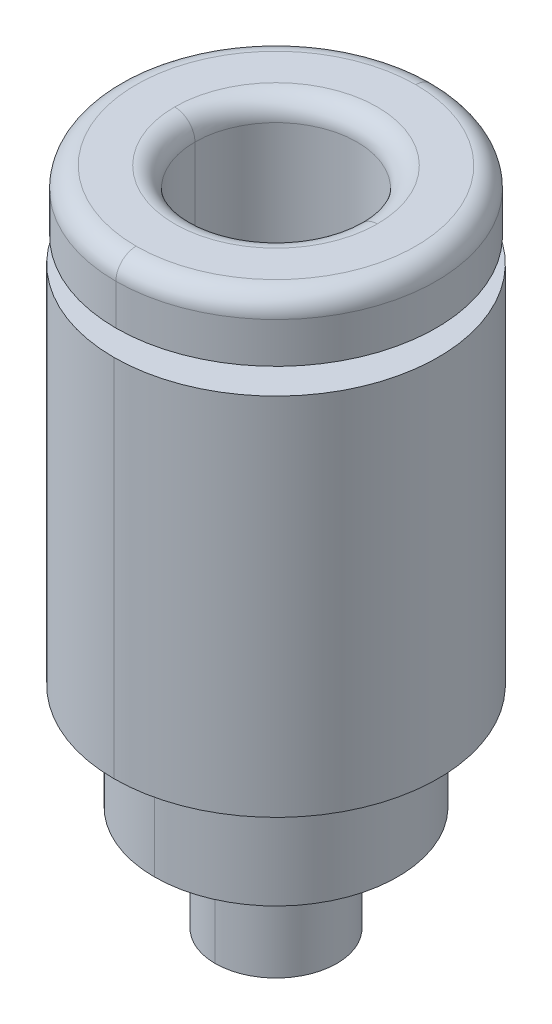
ISO-10303-21;
HEADER;
FILE_DESCRIPTION(('STEP AP214'),'2;1');
FILE_NAME('part.step','',(''),(''),'','','');
FILE_SCHEMA(('AUTOMOTIVE_DESIGN { 1 0 10303 214 1 1 1 1 }'));
ENDSEC;
DATA;
#1=APPLICATION_CONTEXT('core data for automotive mechanical design processes');
#2=APPLICATION_PROTOCOL_DEFINITION('international standard','automotive_design',2000,#1);
#3=PRODUCT_CONTEXT('',#1,'mechanical');
#4=PRODUCT('Part','Part','',(#3));
#5=PRODUCT_RELATED_PRODUCT_CATEGORY('part','',(#4));
#6=PRODUCT_DEFINITION_FORMATION('','',#4);
#7=PRODUCT_DEFINITION_CONTEXT('part definition',#1,'design');
#8=PRODUCT_DEFINITION('design','',#6,#7);
#9=PRODUCT_DEFINITION_SHAPE('','',#8);
#10=(LENGTH_UNIT() NAMED_UNIT(*) SI_UNIT(.MILLI.,.METRE.));
#11=(NAMED_UNIT(*) PLANE_ANGLE_UNIT() SI_UNIT($,.RADIAN.));
#12=(NAMED_UNIT(*) SI_UNIT($,.STERADIAN.) SOLID_ANGLE_UNIT());
#13=UNCERTAINTY_MEASURE_WITH_UNIT(LENGTH_MEASURE(1.E-05),#10,'distance_accuracy_value','');
#14=(GEOMETRIC_REPRESENTATION_CONTEXT(3) GLOBAL_UNCERTAINTY_ASSIGNED_CONTEXT((#13)) GLOBAL_UNIT_ASSIGNED_CONTEXT((#10,
#11,#12)) REPRESENTATION_CONTEXT('',''));
#15=CARTESIAN_POINT('',(0.,0.,0.));
#16=DIRECTION('',(0.,0.,1.));
#17=DIRECTION('',(1.,0.,0.));
#18=AXIS2_PLACEMENT_3D('',#15,#16,#17);
#19=CARTESIAN_POINT('',(0.,0.,0.));
#20=DIRECTION('',(0.,1.,0.));
#21=DIRECTION('',(-1.,0.,0.));
#22=AXIS2_PLACEMENT_3D('',#19,#20,#21);
#23=CYLINDRICAL_SURFACE('',#22,2.);
#24=CARTESIAN_POINT('',(0.,-12.7,0.));
#25=DIRECTION('',(0.,1.,0.));
#26=DIRECTION('',(-1.,0.,0.));
#27=AXIS2_PLACEMENT_3D('',#24,#25,#26);
#28=CIRCLE('',#27,2.);
#29=CARTESIAN_POINT('',(2.,-12.7,0.));
#30=VERTEX_POINT('',#29);
#31=CARTESIAN_POINT('',(-2.,-12.7,0.));
#32=VERTEX_POINT('',#31);
#33=EDGE_CURVE('E41',#30,#32,#28,.T.);
#34=ORIENTED_EDGE('',*,*,#33,.F.);
#35=DIRECTION('',(0.,1.,0.));
#36=VECTOR('',#35,1.);
#37=CARTESIAN_POINT('',(2.,0.,0.));
#38=LINE('',#37,#36);
#39=CARTESIAN_POINT('',(2.,-0.5,0.));
#40=VERTEX_POINT('',#39);
#41=EDGE_CURVE('E10',#30,#40,#38,.T.);
#42=ORIENTED_EDGE('',*,*,#41,.T.);
#43=CARTESIAN_POINT('',(0.,-0.5,0.));
#44=DIRECTION('',(0.,1.,0.));
#45=DIRECTION('',(-1.,0.,0.));
#46=AXIS2_PLACEMENT_3D('',#43,#44,#45);
#47=CIRCLE('',#46,2.);
#48=CARTESIAN_POINT('',(-2.,-0.5,0.));
#49=VERTEX_POINT('',#48);
#50=EDGE_CURVE('E30',#40,#49,#47,.T.);
#51=ORIENTED_EDGE('',*,*,#50,.T.);
#52=DIRECTION('',(0.,1.,0.));
#53=VECTOR('',#52,1.);
#54=CARTESIAN_POINT('',(-2.,0.,0.));
#55=LINE('',#54,#53);
#56=EDGE_CURVE('E344',#32,#49,#55,.T.);
#57=ORIENTED_EDGE('',*,*,#56,.F.);
#58=EDGE_LOOP('',(#34,#42,#51,#57));
#59=FACE_BOUND('',#58,.T.);
#60=ADVANCED_FACE('F16',(#59),#23,.F.);
#61=CARTESIAN_POINT('',(0.,-0.5,0.));
#62=DIRECTION('',(0.,1.,0.));
#63=DIRECTION('',(-1.,0.,0.));
#64=AXIS2_PLACEMENT_3D('',#61,#62,#63);
#65=TOROIDAL_SURFACE('',#64,2.5,0.5);
#66=CARTESIAN_POINT('',(0.,0.,0.));
#67=DIRECTION('',(0.,1.,0.));
#68=DIRECTION('',(-1.,0.,0.));
#69=AXIS2_PLACEMENT_3D('',#66,#67,#68);
#70=CIRCLE('',#69,2.5);
#71=CARTESIAN_POINT('',(-2.5,0.,0.));
#72=VERTEX_POINT('',#71);
#73=CARTESIAN_POINT('',(2.5,0.,0.));
#74=VERTEX_POINT('',#73);
#75=EDGE_CURVE('E295',#72,#74,#70,.T.);
#76=ORIENTED_EDGE('',*,*,#75,.T.);
#77=CARTESIAN_POINT('',(2.5,-0.5,0.));
#78=DIRECTION('',(0.,0.,1.));
#79=DIRECTION('',(1.,0.,0.));
#80=AXIS2_PLACEMENT_3D('',#77,#78,#79);
#81=CIRCLE('',#80,0.5);
#82=EDGE_CURVE('E243',#74,#40,#81,.T.);
#83=ORIENTED_EDGE('',*,*,#82,.T.);
#84=CARTESIAN_POINT('',(0.,-0.5,0.));
#85=DIRECTION('',(0.,1.,0.));
#86=DIRECTION('',(-1.,0.,0.));
#87=AXIS2_PLACEMENT_3D('',#84,#85,#86);
#88=CIRCLE('',#87,2.);
#89=EDGE_CURVE('E247',#49,#40,#88,.T.);
#90=ORIENTED_EDGE('',*,*,#89,.F.);
#91=CARTESIAN_POINT('',(-2.5,-0.5,0.));
#92=DIRECTION('',(0.,0.,-1.));
#93=DIRECTION('',(-1.,0.,0.));
#94=AXIS2_PLACEMENT_3D('',#91,#92,#93);
#95=CIRCLE('',#94,0.5);
#96=EDGE_CURVE('E341',#72,#49,#95,.T.);
#97=ORIENTED_EDGE('',*,*,#96,.F.);
#98=EDGE_LOOP('',(#76,#83,#90,#97));
#99=FACE_BOUND('',#98,.T.);
#100=ADVANCED_FACE('F441',(#99),#65,.T.);
#101=CARTESIAN_POINT('',(0.,-20.5426406871193,0.));
#102=DIRECTION('',(0.,1.,0.));
#103=DIRECTION('',(0.,0.,1.));
#104=AXIS2_PLACEMENT_3D('',#101,#102,#103);
#105=CYLINDRICAL_SURFACE('',#104,1.5);
#106=CARTESIAN_POINT('',(0.,-16.3,0.));
#107=DIRECTION('',(0.,-1.,0.));
#108=DIRECTION('',(0.,0.,1.));
#109=AXIS2_PLACEMENT_3D('',#106,#107,#108);
#110=CIRCLE('',#109,1.5);
#111=CARTESIAN_POINT('',(0.,-16.3,-1.5));
#112=VERTEX_POINT('',#111);
#113=CARTESIAN_POINT('',(0.,-16.3,1.5));
#114=VERTEX_POINT('',#113);
#115=EDGE_CURVE('E322',#112,#114,#110,.T.);
#116=ORIENTED_EDGE('',*,*,#115,.F.);
#117=DIRECTION('',(0.,1.,0.));
#118=VECTOR('',#117,1.);
#119=CARTESIAN_POINT('',(0.,-20.5426406871193,-1.5));
#120=LINE('',#119,#118);
#121=CARTESIAN_POINT('',(0.,-13.7,-1.5));
#122=VERTEX_POINT('',#121);
#123=EDGE_CURVE('E239',#112,#122,#120,.T.);
#124=ORIENTED_EDGE('',*,*,#123,.T.);
#125=CARTESIAN_POINT('',(0.,-13.7,0.));
#126=DIRECTION('',(0.,1.,0.));
#127=DIRECTION('',(0.,0.,1.));
#128=AXIS2_PLACEMENT_3D('',#125,#126,#127);
#129=CIRCLE('',#128,1.5);
#130=CARTESIAN_POINT('',(0.,-13.7,1.5));
#131=VERTEX_POINT('',#130);
#132=EDGE_CURVE('E209',#131,#122,#129,.T.);
#133=ORIENTED_EDGE('',*,*,#132,.F.);
#134=DIRECTION('',(0.,1.,0.));
#135=VECTOR('',#134,1.);
#136=CARTESIAN_POINT('',(0.,-20.5426406871193,1.5));
#137=LINE('',#136,#135);
#138=EDGE_CURVE('E323',#114,#131,#137,.T.);
#139=ORIENTED_EDGE('',*,*,#138,.F.);
#140=EDGE_LOOP('',(#116,#124,#133,#139));
#141=FACE_BOUND('',#140,.T.);
#142=ADVANCED_FACE('F448',(#141),#105,.T.);
#143=CARTESIAN_POINT('',(0.,-22.1852813742385,0.));
#144=DIRECTION('',(0.,1.,0.));
#145=DIRECTION('',(0.,0.,1.));
#146=AXIS2_PLACEMENT_3D('',#143,#144,#145);
#147=CYLINDRICAL_SURFACE('',#146,3.);
#148=CARTESIAN_POINT('',(0.,-13.7,0.));
#149=DIRECTION('',(0.,-1.,0.));
#150=DIRECTION('',(0.,0.,1.));
#151=AXIS2_PLACEMENT_3D('',#148,#149,#150);
#152=CIRCLE('',#151,3.);
#153=CARTESIAN_POINT('',(0.,-13.7,-3.));
#154=VERTEX_POINT('',#153);
#155=CARTESIAN_POINT('',(0.,-13.7,3.));
#156=VERTEX_POINT('',#155);
#157=EDGE_CURVE('E199',#154,#156,#152,.T.);
#158=ORIENTED_EDGE('',*,*,#157,.F.);
#159=DIRECTION('',(0.,1.,0.));
#160=VECTOR('',#159,1.);
#161=CARTESIAN_POINT('',(0.,-22.1852813742385,-3.));
#162=LINE('',#161,#160);
#163=CARTESIAN_POINT('',(0.,-11.1,-3.));
#164=VERTEX_POINT('',#163);
#165=EDGE_CURVE('E224',#154,#164,#162,.T.);
#166=ORIENTED_EDGE('',*,*,#165,.T.);
#167=CARTESIAN_POINT('',(0.,-11.1,0.));
#168=DIRECTION('',(0.,1.,0.));
#169=DIRECTION('',(0.,0.,1.));
#170=AXIS2_PLACEMENT_3D('',#167,#168,#169);
#171=CIRCLE('',#170,3.);
#172=CARTESIAN_POINT('',(0.,-11.1,3.));
#173=VERTEX_POINT('',#172);
#174=EDGE_CURVE('E214',#173,#164,#171,.T.);
#175=ORIENTED_EDGE('',*,*,#174,.F.);
#176=DIRECTION('',(0.,1.,0.));
#177=VECTOR('',#176,1.);
#178=CARTESIAN_POINT('',(0.,-22.1852813742385,3.));
#179=LINE('',#178,#177);
#180=EDGE_CURVE('E213',#156,#173,#179,.T.);
#181=ORIENTED_EDGE('',*,*,#180,.F.);
#182=EDGE_LOOP('',(#158,#166,#175,#181));
#183=FACE_BOUND('',#182,.T.);
#184=ADVANCED_FACE('F212',(#183),#147,.T.);
#185=CARTESIAN_POINT('',(0.,-22.4137084989848,0.));
#186=DIRECTION('',(0.,1.,0.));
#187=DIRECTION('',(0.,0.,1.));
#188=AXIS2_PLACEMENT_3D('',#185,#186,#187);
#189=CYLINDRICAL_SURFACE('',#188,4.);
#190=CARTESIAN_POINT('',(0.,-11.1,0.));
#191=DIRECTION('',(0.,-1.,0.));
#192=DIRECTION('',(0.,0.,1.));
#193=AXIS2_PLACEMENT_3D('',#190,#191,#192);
#194=CIRCLE('',#193,4.);
#195=CARTESIAN_POINT('',(0.,-11.1,-4.));
#196=VERTEX_POINT('',#195);
#197=CARTESIAN_POINT('',(0.,-11.1,4.));
#198=VERTEX_POINT('',#197);
#199=EDGE_CURVE('E151',#196,#198,#194,.T.);
#200=ORIENTED_EDGE('',*,*,#199,.F.);
#201=DIRECTION('',(0.,1.,0.));
#202=VECTOR('',#201,1.);
#203=CARTESIAN_POINT('',(0.,-22.4137084989848,-4.));
#204=LINE('',#203,#202);
#205=CARTESIAN_POINT('',(0.,-2.1,-4.));
#206=VERTEX_POINT('',#205);
#207=EDGE_CURVE('E333',#196,#206,#204,.T.);
#208=ORIENTED_EDGE('',*,*,#207,.T.);
#209=CARTESIAN_POINT('',(0.,-2.1,0.));
#210=DIRECTION('',(0.,1.,0.));
#211=DIRECTION('',(0.,0.,1.));
#212=AXIS2_PLACEMENT_3D('',#209,#210,#211);
#213=CIRCLE('',#212,4.);
#214=CARTESIAN_POINT('',(0.,-2.1,4.));
#215=VERTEX_POINT('',#214);
#216=EDGE_CURVE('E268',#215,#206,#213,.T.);
#217=ORIENTED_EDGE('',*,*,#216,.F.);
#218=DIRECTION('',(0.,1.,0.));
#219=VECTOR('',#218,1.);
#220=CARTESIAN_POINT('',(0.,-22.4137084989848,4.));
#221=LINE('',#220,#219);
#222=EDGE_CURVE('E138',#198,#215,#221,.T.);
#223=ORIENTED_EDGE('',*,*,#222,.F.);
#224=EDGE_LOOP('',(#200,#208,#217,#223));
#225=FACE_BOUND('',#224,.T.);
#226=ADVANCED_FACE('F428',(#225),#189,.T.);
#227=CARTESIAN_POINT('',(0.,-0.5,0.));
#228=DIRECTION('',(0.,1.,0.));
#229=DIRECTION('',(0.,0.,1.));
#230=AXIS2_PLACEMENT_3D('',#227,#228,#229);
#231=TOROIDAL_SURFACE('',#230,3.45,0.5);
#232=CARTESIAN_POINT('',(0.,-0.5,0.));
#233=DIRECTION('',(0.,1.,0.));
#234=DIRECTION('',(0.,0.,1.));
#235=AXIS2_PLACEMENT_3D('',#232,#233,#234);
#236=CIRCLE('',#235,3.95);
#237=CARTESIAN_POINT('',(0.,-0.5,3.95));
#238=VERTEX_POINT('',#237);
#239=CARTESIAN_POINT('',(0.,-0.5,-3.95));
#240=VERTEX_POINT('',#239);
#241=EDGE_CURVE('E332',#238,#240,#236,.T.);
#242=ORIENTED_EDGE('',*,*,#241,.T.);
#243=CARTESIAN_POINT('',(0.,-0.5,-3.45));
#244=DIRECTION('',(1.,0.,0.));
#245=DIRECTION('',(0.,0.,-1.));
#246=AXIS2_PLACEMENT_3D('',#243,#244,#245);
#247=CIRCLE('',#246,0.5);
#248=CARTESIAN_POINT('',(0.,0.,-3.45));
#249=VERTEX_POINT('',#248);
#250=EDGE_CURVE('E336',#240,#249,#247,.T.);
#251=ORIENTED_EDGE('',*,*,#250,.T.);
#252=CARTESIAN_POINT('',(0.,0.,0.));
#253=DIRECTION('',(0.,1.,0.));
#254=DIRECTION('',(0.,0.,1.));
#255=AXIS2_PLACEMENT_3D('',#252,#253,#254);
#256=CIRCLE('',#255,3.45);
#257=CARTESIAN_POINT('',(0.,0.,3.45));
#258=VERTEX_POINT('',#257);
#259=EDGE_CURVE('E277',#258,#249,#256,.T.);
#260=ORIENTED_EDGE('',*,*,#259,.F.);
#261=CARTESIAN_POINT('',(0.,-0.5,3.45));
#262=DIRECTION('',(-1.,0.,0.));
#263=DIRECTION('',(0.,0.,1.));
#264=AXIS2_PLACEMENT_3D('',#261,#262,#263);
#265=CIRCLE('',#264,0.5);
#266=EDGE_CURVE('E262',#238,#258,#265,.T.);
#267=ORIENTED_EDGE('',*,*,#266,.F.);
#268=EDGE_LOOP('',(#242,#251,#260,#267));
#269=FACE_BOUND('',#268,.T.);
#270=ADVANCED_FACE('F529',(#269),#231,.T.);
#271=CARTESIAN_POINT('',(0.,0.,0.));
#272=DIRECTION('',(0.,1.,0.));
#273=DIRECTION('',(0.,0.,1.));
#274=AXIS2_PLACEMENT_3D('',#271,#272,#273);
#275=CYLINDRICAL_SURFACE('',#274,3.95);
#276=CARTESIAN_POINT('',(0.,-1.5,0.));
#277=DIRECTION('',(0.,1.,0.));
#278=DIRECTION('',(0.,0.,1.));
#279=AXIS2_PLACEMENT_3D('',#276,#277,#278);
#280=CIRCLE('',#279,3.95);
#281=CARTESIAN_POINT('',(0.,-1.5,3.95));
#282=VERTEX_POINT('',#281);
#283=CARTESIAN_POINT('',(0.,-1.5,-3.95));
#284=VERTEX_POINT('',#283);
#285=EDGE_CURVE('E340',#282,#284,#280,.T.);
#286=ORIENTED_EDGE('',*,*,#285,.T.);
#287=DIRECTION('',(0.,1.,0.));
#288=VECTOR('',#287,1.);
#289=CARTESIAN_POINT('',(0.,0.,-3.95));
#290=LINE('',#289,#288);
#291=EDGE_CURVE('E337',#284,#240,#290,.T.);
#292=ORIENTED_EDGE('',*,*,#291,.T.);
#293=ORIENTED_EDGE('',*,*,#241,.F.);
#294=DIRECTION('',(0.,1.,0.));
#295=VECTOR('',#294,1.);
#296=CARTESIAN_POINT('',(0.,0.,3.95));
#297=LINE('',#296,#295);
#298=EDGE_CURVE('E296',#282,#238,#297,.T.);
#299=ORIENTED_EDGE('',*,*,#298,.F.);
#300=EDGE_LOOP('',(#286,#292,#293,#299));
#301=FACE_BOUND('',#300,.T.);
#302=ADVANCED_FACE('F457',(#301),#275,.T.);
#303=CARTESIAN_POINT('',(0.,0.,0.));
#304=DIRECTION('',(0.,1.,0.));
#305=DIRECTION('',(0.,0.,1.));
#306=AXIS2_PLACEMENT_3D('',#303,#304,#305);
#307=CYLINDRICAL_SURFACE('',#306,2.195);
#308=CARTESIAN_POINT('',(0.,-2.1,0.));
#309=DIRECTION('',(0.,1.,0.));
#310=DIRECTION('',(0.,0.,1.));
#311=AXIS2_PLACEMENT_3D('',#308,#309,#310);
#312=CIRCLE('',#311,2.195);
#313=CARTESIAN_POINT('',(0.,-2.1,2.195));
#314=VERTEX_POINT('',#313);
#315=CARTESIAN_POINT('',(0.,-2.1,-2.195));
#316=VERTEX_POINT('',#315);
#317=EDGE_CURVE('E274',#314,#316,#312,.T.);
#318=ORIENTED_EDGE('',*,*,#317,.T.);
#319=DIRECTION('',(0.,1.,0.));
#320=VECTOR('',#319,1.);
#321=CARTESIAN_POINT('',(0.,0.,-2.195));
#322=LINE('',#321,#320);
#323=CARTESIAN_POINT('',(0.,-1.5,-2.195));
#324=VERTEX_POINT('',#323);
#325=EDGE_CURVE('E271',#316,#324,#322,.T.);
#326=ORIENTED_EDGE('',*,*,#325,.T.);
#327=CARTESIAN_POINT('',(0.,-1.5,0.));
#328=DIRECTION('',(0.,1.,0.));
#329=DIRECTION('',(0.,0.,1.));
#330=AXIS2_PLACEMENT_3D('',#327,#328,#329);
#331=CIRCLE('',#330,2.195);
#332=CARTESIAN_POINT('',(0.,-1.5,2.195));
#333=VERTEX_POINT('',#332);
#334=EDGE_CURVE('E249',#333,#324,#331,.T.);
#335=ORIENTED_EDGE('',*,*,#334,.F.);
#336=DIRECTION('',(0.,1.,0.));
#337=VECTOR('',#336,1.);
#338=CARTESIAN_POINT('',(0.,0.,2.195));
#339=LINE('',#338,#337);
#340=EDGE_CURVE('E255',#314,#333,#339,.T.);
#341=ORIENTED_EDGE('',*,*,#340,.F.);
#342=EDGE_LOOP('',(#318,#326,#335,#341));
#343=FACE_BOUND('',#342,.T.);
#344=ADVANCED_FACE('F460',(#343),#307,.T.);
#345=CARTESIAN_POINT('',(0.,0.,0.));
#346=DIRECTION('',(0.,-1.,0.));
#347=DIRECTION('',(0.,0.,-1.));
#348=AXIS2_PLACEMENT_3D('',#345,#346,#347);
#349=PLANE('',#348);
#350=ORIENTED_EDGE('',*,*,#259,.T.);
#351=CARTESIAN_POINT('',(0.,0.,0.));
#352=DIRECTION('',(0.,1.,0.));
#353=DIRECTION('',(0.,0.,1.));
#354=AXIS2_PLACEMENT_3D('',#351,#352,#353);
#355=CIRCLE('',#354,3.45);
#356=EDGE_CURVE('E316',#249,#258,#355,.T.);
#357=ORIENTED_EDGE('',*,*,#356,.T.);
#358=EDGE_LOOP('',(#350,#357));
#359=FACE_BOUND('',#358,.T.);
#360=ORIENTED_EDGE('',*,*,#75,.F.);
#361=CARTESIAN_POINT('',(0.,0.,0.));
#362=DIRECTION('',(0.,1.,0.));
#363=DIRECTION('',(-1.,0.,0.));
#364=AXIS2_PLACEMENT_3D('',#361,#362,#363);
#365=CIRCLE('',#364,2.5);
#366=EDGE_CURVE('E237',#74,#72,#365,.T.);
#367=ORIENTED_EDGE('',*,*,#366,.F.);
#368=EDGE_LOOP('',(#360,#367));
#369=FACE_BOUND('',#368,.T.);
#370=ADVANCED_FACE('F458',(#359,#369),#349,.F.);
#371=CARTESIAN_POINT('',(0.,0.,0.));
#372=DIRECTION('',(0.,1.,0.));
#373=DIRECTION('',(0.,0.,1.));
#374=AXIS2_PLACEMENT_3D('',#371,#372,#373);
#375=CYLINDRICAL_SURFACE('',#374,2.195);
#376=ORIENTED_EDGE('',*,*,#325,.F.);
#377=CARTESIAN_POINT('',(0.,-2.1,0.));
#378=DIRECTION('',(0.,1.,0.));
#379=DIRECTION('',(0.,0.,1.));
#380=AXIS2_PLACEMENT_3D('',#377,#378,#379);
#381=CIRCLE('',#380,2.195);
#382=EDGE_CURVE('E278',#316,#314,#381,.T.);
#383=ORIENTED_EDGE('',*,*,#382,.T.);
#384=ORIENTED_EDGE('',*,*,#340,.T.);
#385=CARTESIAN_POINT('',(0.,-1.5,0.));
#386=DIRECTION('',(0.,1.,0.));
#387=DIRECTION('',(0.,0.,1.));
#388=AXIS2_PLACEMENT_3D('',#385,#386,#387);
#389=CIRCLE('',#388,2.195);
#390=EDGE_CURVE('E254',#324,#333,#389,.T.);
#391=ORIENTED_EDGE('',*,*,#390,.F.);
#392=EDGE_LOOP('',(#376,#383,#384,#391));
#393=FACE_BOUND('',#392,.T.);
#394=ADVANCED_FACE('F494',(#393),#375,.T.);
#395=CARTESIAN_POINT('',(3.95,-1.5,0.));
#396=DIRECTION('',(0.,1.,0.));
#397=DIRECTION('',(1.,0.,0.));
#398=AXIS2_PLACEMENT_3D('',#395,#396,#397);
#399=PLANE('',#398);
#400=ORIENTED_EDGE('',*,*,#285,.F.);
#401=CARTESIAN_POINT('',(0.,-1.5,0.));
#402=DIRECTION('',(0.,1.,0.));
#403=DIRECTION('',(0.,0.,1.));
#404=AXIS2_PLACEMENT_3D('',#401,#402,#403);
#405=CIRCLE('',#404,3.95);
#406=EDGE_CURVE('E329',#284,#282,#405,.T.);
#407=ORIENTED_EDGE('',*,*,#406,.F.);
#408=EDGE_LOOP('',(#400,#407));
#409=FACE_BOUND('',#408,.T.);
#410=ORIENTED_EDGE('',*,*,#334,.T.);
#411=ORIENTED_EDGE('',*,*,#390,.T.);
#412=EDGE_LOOP('',(#410,#411));
#413=FACE_BOUND('',#412,.T.);
#414=ADVANCED_FACE('F498',(#409,#413),#399,.F.);
#415=CARTESIAN_POINT('',(0.,0.,0.));
#416=DIRECTION('',(0.,1.,0.));
#417=DIRECTION('',(0.,0.,1.));
#418=AXIS2_PLACEMENT_3D('',#415,#416,#417);
#419=CYLINDRICAL_SURFACE('',#418,3.95);
#420=ORIENTED_EDGE('',*,*,#291,.F.);
#421=ORIENTED_EDGE('',*,*,#406,.T.);
#422=ORIENTED_EDGE('',*,*,#298,.T.);
#423=CARTESIAN_POINT('',(0.,-0.5,0.));
#424=DIRECTION('',(0.,1.,0.));
#425=DIRECTION('',(0.,0.,1.));
#426=AXIS2_PLACEMENT_3D('',#423,#424,#425);
#427=CIRCLE('',#426,3.95);
#428=EDGE_CURVE('E270',#240,#238,#427,.T.);
#429=ORIENTED_EDGE('',*,*,#428,.F.);
#430=EDGE_LOOP('',(#420,#421,#422,#429));
#431=FACE_BOUND('',#430,.T.);
#432=ADVANCED_FACE('F452',(#431),#419,.T.);
#433=CARTESIAN_POINT('',(0.,-0.5,0.));
#434=DIRECTION('',(0.,1.,0.));
#435=DIRECTION('',(0.,0.,1.));
#436=AXIS2_PLACEMENT_3D('',#433,#434,#435);
#437=TOROIDAL_SURFACE('',#436,3.45,0.5);
#438=ORIENTED_EDGE('',*,*,#250,.F.);
#439=ORIENTED_EDGE('',*,*,#428,.T.);
#440=ORIENTED_EDGE('',*,*,#266,.T.);
#441=ORIENTED_EDGE('',*,*,#356,.F.);
#442=EDGE_LOOP('',(#438,#439,#440,#441));
#443=FACE_BOUND('',#442,.T.);
#444=ADVANCED_FACE('F438',(#443),#437,.T.);
#445=CARTESIAN_POINT('',(0.,-2.1,0.));
#446=DIRECTION('',(0.,1.,0.));
#447=DIRECTION('',(1.,0.,0.));
#448=AXIS2_PLACEMENT_3D('',#445,#446,#447);
#449=PLANE('',#448);
#450=ORIENTED_EDGE('',*,*,#216,.T.);
#451=CARTESIAN_POINT('',(0.,-2.1,0.));
#452=DIRECTION('',(0.,1.,0.));
#453=DIRECTION('',(0.,0.,1.));
#454=AXIS2_PLACEMENT_3D('',#451,#452,#453);
#455=CIRCLE('',#454,4.);
#456=EDGE_CURVE('E384',#206,#215,#455,.T.);
#457=ORIENTED_EDGE('',*,*,#456,.T.);
#458=EDGE_LOOP('',(#450,#457));
#459=FACE_BOUND('',#458,.T.);
#460=ORIENTED_EDGE('',*,*,#317,.F.);
#461=ORIENTED_EDGE('',*,*,#382,.F.);
#462=EDGE_LOOP('',(#460,#461));
#463=FACE_BOUND('',#462,.T.);
#464=ADVANCED_FACE('F424',(#459,#463),#449,.T.);
#465=CARTESIAN_POINT('',(0.,-22.4137084989848,0.));
#466=DIRECTION('',(0.,1.,0.));
#467=DIRECTION('',(0.,0.,1.));
#468=AXIS2_PLACEMENT_3D('',#465,#466,#467);
#469=CYLINDRICAL_SURFACE('',#468,4.);
#470=ORIENTED_EDGE('',*,*,#207,.F.);
#471=CARTESIAN_POINT('',(0.,-11.1,0.));
#472=DIRECTION('',(0.,-1.,0.));
#473=DIRECTION('',(0.,0.,1.));
#474=AXIS2_PLACEMENT_3D('',#471,#472,#473);
#475=CIRCLE('',#474,4.);
#476=EDGE_CURVE('E235',#198,#196,#475,.T.);
#477=ORIENTED_EDGE('',*,*,#476,.F.);
#478=ORIENTED_EDGE('',*,*,#222,.T.);
#479=ORIENTED_EDGE('',*,*,#456,.F.);
#480=EDGE_LOOP('',(#470,#477,#478,#479));
#481=FACE_BOUND('',#480,.T.);
#482=ADVANCED_FACE('F427',(#481),#469,.T.);
#483=CARTESIAN_POINT('',(0.,-11.1,0.));
#484=DIRECTION('',(0.,1.,0.));
#485=DIRECTION('',(1.,0.,0.));
#486=AXIS2_PLACEMENT_3D('',#483,#484,#485);
#487=PLANE('',#486);
#488=ORIENTED_EDGE('',*,*,#476,.T.);
#489=ORIENTED_EDGE('',*,*,#199,.T.);
#490=EDGE_LOOP('',(#488,#489));
#491=FACE_BOUND('',#490,.T.);
#492=ORIENTED_EDGE('',*,*,#174,.T.);
#493=CARTESIAN_POINT('',(0.,-11.1,0.));
#494=DIRECTION('',(0.,1.,0.));
#495=DIRECTION('',(0.,0.,1.));
#496=AXIS2_PLACEMENT_3D('',#493,#494,#495);
#497=CIRCLE('',#496,3.);
#498=EDGE_CURVE('E219',#164,#173,#497,.T.);
#499=ORIENTED_EDGE('',*,*,#498,.T.);
#500=EDGE_LOOP('',(#492,#499));
#501=FACE_BOUND('',#500,.T.);
#502=ADVANCED_FACE('F431',(#491,#501),#487,.F.);
#503=CARTESIAN_POINT('',(0.,-22.1852813742385,0.));
#504=DIRECTION('',(0.,1.,0.));
#505=DIRECTION('',(0.,0.,1.));
#506=AXIS2_PLACEMENT_3D('',#503,#504,#505);
#507=CYLINDRICAL_SURFACE('',#506,3.);
#508=ORIENTED_EDGE('',*,*,#165,.F.);
#509=CARTESIAN_POINT('',(0.,-13.7,0.));
#510=DIRECTION('',(0.,-1.,0.));
#511=DIRECTION('',(0.,0.,1.));
#512=AXIS2_PLACEMENT_3D('',#509,#510,#511);
#513=CIRCLE('',#512,3.);
#514=EDGE_CURVE('E202',#156,#154,#513,.T.);
#515=ORIENTED_EDGE('',*,*,#514,.F.);
#516=ORIENTED_EDGE('',*,*,#180,.T.);
#517=ORIENTED_EDGE('',*,*,#498,.F.);
#518=EDGE_LOOP('',(#508,#515,#516,#517));
#519=FACE_BOUND('',#518,.T.);
#520=ADVANCED_FACE('F225',(#519),#507,.T.);
#521=CARTESIAN_POINT('',(0.,-13.7,0.));
#522=DIRECTION('',(0.,1.,0.));
#523=DIRECTION('',(1.,0.,0.));
#524=AXIS2_PLACEMENT_3D('',#521,#522,#523);
#525=PLANE('',#524);
#526=ORIENTED_EDGE('',*,*,#514,.T.);
#527=ORIENTED_EDGE('',*,*,#157,.T.);
#528=EDGE_LOOP('',(#526,#527));
#529=FACE_BOUND('',#528,.T.);
#530=ORIENTED_EDGE('',*,*,#132,.T.);
#531=CARTESIAN_POINT('',(0.,-13.7,0.));
#532=DIRECTION('',(0.,1.,0.));
#533=DIRECTION('',(0.,0.,1.));
#534=AXIS2_PLACEMENT_3D('',#531,#532,#533);
#535=CIRCLE('',#534,1.5);
#536=EDGE_CURVE('E417',#122,#131,#535,.T.);
#537=ORIENTED_EDGE('',*,*,#536,.T.);
#538=EDGE_LOOP('',(#530,#537));
#539=FACE_BOUND('',#538,.T.);
#540=ADVANCED_FACE('F205',(#529,#539),#525,.F.);
#541=CARTESIAN_POINT('',(0.,-20.5426406871193,0.));
#542=DIRECTION('',(0.,1.,0.));
#543=DIRECTION('',(0.,0.,1.));
#544=AXIS2_PLACEMENT_3D('',#541,#542,#543);
#545=CYLINDRICAL_SURFACE('',#544,1.5);
#546=ORIENTED_EDGE('',*,*,#123,.F.);
#547=CARTESIAN_POINT('',(0.,-16.3,0.));
#548=DIRECTION('',(0.,-1.,0.));
#549=DIRECTION('',(0.,0.,1.));
#550=AXIS2_PLACEMENT_3D('',#547,#548,#549);
#551=CIRCLE('',#550,1.5);
#552=EDGE_CURVE('E317',#114,#112,#551,.T.);
#553=ORIENTED_EDGE('',*,*,#552,.F.);
#554=ORIENTED_EDGE('',*,*,#138,.T.);
#555=ORIENTED_EDGE('',*,*,#536,.F.);
#556=EDGE_LOOP('',(#546,#553,#554,#555));
#557=FACE_BOUND('',#556,.T.);
#558=ADVANCED_FACE('F523',(#557),#545,.T.);
#559=CARTESIAN_POINT('',(0.,-16.3,0.));
#560=DIRECTION('',(0.,1.,0.));
#561=DIRECTION('',(1.,0.,0.));
#562=AXIS2_PLACEMENT_3D('',#559,#560,#561);
#563=PLANE('',#562);
#564=ORIENTED_EDGE('',*,*,#552,.T.);
#565=ORIENTED_EDGE('',*,*,#115,.T.);
#566=EDGE_LOOP('',(#564,#565));
#567=FACE_BOUND('',#566,.T.);
#568=DIRECTION('',(-0.5,0.,0.866025403784439));
#569=VECTOR('',#568,1.);
#570=CARTESIAN_POINT('',(-0.866025403784439,-16.3,0.));
#571=LINE('',#570,#569);
#572=CARTESIAN_POINT('',(-0.433012701892219,-16.3,-0.75));
#573=VERTEX_POINT('',#572);
#574=CARTESIAN_POINT('',(-0.866025403784439,-16.3,0.));
#575=VERTEX_POINT('',#574);
#576=EDGE_CURVE('E351',#573,#575,#571,.T.);
#577=ORIENTED_EDGE('',*,*,#576,.T.);
#578=DIRECTION('',(0.5,0.,0.866025403784439));
#579=VECTOR('',#578,1.);
#580=CARTESIAN_POINT('',(-0.43301270189222,-16.3,0.75));
#581=LINE('',#580,#579);
#582=CARTESIAN_POINT('',(-0.43301270189222,-16.3,0.75));
#583=VERTEX_POINT('',#582);
#584=EDGE_CURVE('E358',#575,#583,#581,.T.);
#585=ORIENTED_EDGE('',*,*,#584,.T.);
#586=DIRECTION('',(1.,0.,0.));
#587=VECTOR('',#586,1.);
#588=CARTESIAN_POINT('',(0.433012701892219,-16.3,0.75));
#589=LINE('',#588,#587);
#590=CARTESIAN_POINT('',(0.433012701892219,-16.3,0.75));
#591=VERTEX_POINT('',#590);
#592=EDGE_CURVE('E368',#583,#591,#589,.T.);
#593=ORIENTED_EDGE('',*,*,#592,.T.);
#594=DIRECTION('',(0.5,0.,-0.866025403784439));
#595=VECTOR('',#594,1.);
#596=CARTESIAN_POINT('',(0.866025403784439,-16.3,0.));
#597=LINE('',#596,#595);
#598=CARTESIAN_POINT('',(0.866025403784439,-16.3,0.));
#599=VERTEX_POINT('',#598);
#600=EDGE_CURVE('E362',#591,#599,#597,.T.);
#601=ORIENTED_EDGE('',*,*,#600,.T.);
#602=DIRECTION('',(-0.5,0.,-0.866025403784439));
#603=VECTOR('',#602,1.);
#604=CARTESIAN_POINT('',(0.43301270189222,-16.3,-0.75));
#605=LINE('',#604,#603);
#606=CARTESIAN_POINT('',(0.43301270189222,-16.3,-0.75));
#607=VERTEX_POINT('',#606);
#608=EDGE_CURVE('E238',#599,#607,#605,.T.);
#609=ORIENTED_EDGE('',*,*,#608,.T.);
#610=DIRECTION('',(-1.,0.,0.));
#611=VECTOR('',#610,1.);
#612=CARTESIAN_POINT('',(-0.433012701892219,-16.3,-0.75));
#613=LINE('',#612,#611);
#614=EDGE_CURVE('E234',#607,#573,#613,.T.);
#615=ORIENTED_EDGE('',*,*,#614,.T.);
#616=EDGE_LOOP('',(#577,#585,#593,#601,#609,#615));
#617=FACE_BOUND('',#616,.T.);
#618=ADVANCED_FACE('F482',(#567,#617),#563,.F.);
#619=CARTESIAN_POINT('',(0.,-0.5,0.));
#620=DIRECTION('',(0.,1.,0.));
#621=DIRECTION('',(-1.,0.,0.));
#622=AXIS2_PLACEMENT_3D('',#619,#620,#621);
#623=TOROIDAL_SURFACE('',#622,2.5,0.5);
#624=ORIENTED_EDGE('',*,*,#82,.F.);
#625=ORIENTED_EDGE('',*,*,#366,.T.);
#626=ORIENTED_EDGE('',*,*,#96,.T.);
#627=ORIENTED_EDGE('',*,*,#50,.F.);
#628=EDGE_LOOP('',(#624,#625,#626,#627));
#629=FACE_BOUND('',#628,.T.);
#630=ADVANCED_FACE('F582',(#629),#623,.T.);
#631=CARTESIAN_POINT('',(0.,0.,0.));
#632=DIRECTION('',(0.,1.,0.));
#633=DIRECTION('',(-1.,0.,0.));
#634=AXIS2_PLACEMENT_3D('',#631,#632,#633);
#635=CYLINDRICAL_SURFACE('',#634,2.);
#636=ORIENTED_EDGE('',*,*,#41,.F.);
#637=CARTESIAN_POINT('',(0.,-12.7,0.));
#638=DIRECTION('',(0.,1.,0.));
#639=DIRECTION('',(-1.,0.,0.));
#640=AXIS2_PLACEMENT_3D('',#637,#638,#639);
#641=CIRCLE('',#640,2.);
#642=EDGE_CURVE('E244',#32,#30,#641,.T.);
#643=ORIENTED_EDGE('',*,*,#642,.F.);
#644=ORIENTED_EDGE('',*,*,#56,.T.);
#645=ORIENTED_EDGE('',*,*,#89,.T.);
#646=EDGE_LOOP('',(#636,#643,#644,#645));
#647=FACE_BOUND('',#646,.T.);
#648=ADVANCED_FACE('F606',(#647),#635,.F.);
#649=CARTESIAN_POINT('',(0.,-12.7,0.));
#650=DIRECTION('',(0.,1.,0.));
#651=DIRECTION('',(1.,0.,0.));
#652=AXIS2_PLACEMENT_3D('',#649,#650,#651);
#653=PLANE('',#652);
#654=ORIENTED_EDGE('',*,*,#642,.T.);
#655=ORIENTED_EDGE('',*,*,#33,.T.);
#656=EDGE_LOOP('',(#654,#655));
#657=FACE_BOUND('',#656,.T.);
#658=DIRECTION('',(0.5,0.,0.866025403784439));
#659=VECTOR('',#658,1.);
#660=CARTESIAN_POINT('',(-0.649519052838329,-12.7,0.375));
#661=LINE('',#660,#659);
#662=CARTESIAN_POINT('',(-0.866025403784439,-12.7,0.));
#663=VERTEX_POINT('',#662);
#664=CARTESIAN_POINT('',(-0.43301270189222,-12.7,0.75));
#665=VERTEX_POINT('',#664);
#666=EDGE_CURVE('E258',#663,#665,#661,.T.);
#667=ORIENTED_EDGE('',*,*,#666,.F.);
#668=DIRECTION('',(-0.5,0.,0.866025403784439));
#669=VECTOR('',#668,1.);
#670=CARTESIAN_POINT('',(-0.649519052838329,-12.7,-0.375));
#671=LINE('',#670,#669);
#672=CARTESIAN_POINT('',(-0.433012701892219,-12.7,-0.75));
#673=VERTEX_POINT('',#672);
#674=EDGE_CURVE('E164',#673,#663,#671,.T.);
#675=ORIENTED_EDGE('',*,*,#674,.F.);
#676=DIRECTION('',(-1.,0.,0.));
#677=VECTOR('',#676,1.);
#678=CARTESIAN_POINT('',(0.,-12.7,-0.75));
#679=LINE('',#678,#677);
#680=CARTESIAN_POINT('',(0.43301270189222,-12.7,-0.75));
#681=VERTEX_POINT('',#680);
#682=EDGE_CURVE('E178',#681,#673,#679,.T.);
#683=ORIENTED_EDGE('',*,*,#682,.F.);
#684=DIRECTION('',(-0.5,0.,-0.866025403784439));
#685=VECTOR('',#684,1.);
#686=CARTESIAN_POINT('',(0.64951905283833,-12.7,-0.375));
#687=LINE('',#686,#685);
#688=CARTESIAN_POINT('',(0.866025403784439,-12.7,0.));
#689=VERTEX_POINT('',#688);
#690=EDGE_CURVE('E303',#689,#681,#687,.T.);
#691=ORIENTED_EDGE('',*,*,#690,.F.);
#692=DIRECTION('',(0.5,0.,-0.866025403784439));
#693=VECTOR('',#692,1.);
#694=CARTESIAN_POINT('',(0.64951905283833,-12.7,0.375));
#695=LINE('',#694,#693);
#696=CARTESIAN_POINT('',(0.433012701892219,-12.7,0.75));
#697=VERTEX_POINT('',#696);
#698=EDGE_CURVE('E413',#697,#689,#695,.T.);
#699=ORIENTED_EDGE('',*,*,#698,.F.);
#700=DIRECTION('',(1.,0.,0.));
#701=VECTOR('',#700,1.);
#702=CARTESIAN_POINT('',(0.,-12.7,0.75));
#703=LINE('',#702,#701);
#704=EDGE_CURVE('E285',#665,#697,#703,.T.);
#705=ORIENTED_EDGE('',*,*,#704,.F.);
#706=EDGE_LOOP('',(#667,#675,#683,#691,#699,#705));
#707=FACE_BOUND('',#706,.T.);
#708=ADVANCED_FACE('F479',(#657,#707),#653,.T.);
#709=CARTESIAN_POINT('',(-0.43301270189222,-16.3,0.75));
#710=DIRECTION('',(-0.866025403784439,0.,0.5));
#711=DIRECTION('',(0.,1.,0.));
#712=AXIS2_PLACEMENT_3D('',#709,#710,#711);
#713=PLANE('',#712);
#714=ORIENTED_EDGE('',*,*,#666,.T.);
#715=DIRECTION('',(0.,1.,0.));
#716=VECTOR('',#715,1.);
#717=CARTESIAN_POINT('',(-0.43301270189222,-16.3,0.75));
#718=LINE('',#717,#716);
#719=EDGE_CURVE('E281',#583,#665,#718,.T.);
#720=ORIENTED_EDGE('',*,*,#719,.F.);
#721=ORIENTED_EDGE('',*,*,#584,.F.);
#722=DIRECTION('',(0.,1.,0.));
#723=VECTOR('',#722,1.);
#724=CARTESIAN_POINT('',(-0.866025403784439,-16.3,0.));
#725=LINE('',#724,#723);
#726=EDGE_CURVE('E257',#575,#663,#725,.T.);
#727=ORIENTED_EDGE('',*,*,#726,.T.);
#728=EDGE_LOOP('',(#714,#720,#721,#727));
#729=FACE_BOUND('',#728,.T.);
#730=ADVANCED_FACE('F542',(#729),#713,.F.);
#731=CARTESIAN_POINT('',(-0.866025403784439,-16.3,0.));
#732=DIRECTION('',(-0.866025403784439,0.,-0.5));
#733=DIRECTION('',(-0.5,0.,0.866025403784439));
#734=AXIS2_PLACEMENT_3D('',#731,#732,#733);
#735=PLANE('',#734);
#736=ORIENTED_EDGE('',*,*,#674,.T.);
#737=ORIENTED_EDGE('',*,*,#726,.F.);
#738=ORIENTED_EDGE('',*,*,#576,.F.);
#739=DIRECTION('',(0.,1.,0.));
#740=VECTOR('',#739,1.);
#741=CARTESIAN_POINT('',(-0.433012701892219,-16.3,-0.75));
#742=LINE('',#741,#740);
#743=EDGE_CURVE('E261',#573,#673,#742,.T.);
#744=ORIENTED_EDGE('',*,*,#743,.T.);
#745=EDGE_LOOP('',(#736,#737,#738,#744));
#746=FACE_BOUND('',#745,.T.);
#747=ADVANCED_FACE('F472',(#746),#735,.F.);
#748=CARTESIAN_POINT('',(-0.433012701892219,-16.3,-0.75));
#749=DIRECTION('',(0.,0.,-1.));
#750=DIRECTION('',(0.,-1.,0.));
#751=AXIS2_PLACEMENT_3D('',#748,#749,#750);
#752=PLANE('',#751);
#753=ORIENTED_EDGE('',*,*,#682,.T.);
#754=ORIENTED_EDGE('',*,*,#743,.F.);
#755=ORIENTED_EDGE('',*,*,#614,.F.);
#756=DIRECTION('',(0.,1.,0.));
#757=VECTOR('',#756,1.);
#758=CARTESIAN_POINT('',(0.43301270189222,-16.3,-0.75));
#759=LINE('',#758,#757);
#760=EDGE_CURVE('E297',#607,#681,#759,.T.);
#761=ORIENTED_EDGE('',*,*,#760,.T.);
#762=EDGE_LOOP('',(#753,#754,#755,#761));
#763=FACE_BOUND('',#762,.T.);
#764=ADVANCED_FACE('F463',(#763),#752,.F.);
#765=CARTESIAN_POINT('',(0.43301270189222,-16.3,-0.75));
#766=DIRECTION('',(0.866025403784439,0.,-0.5));
#767=DIRECTION('',(0.,-1.,0.));
#768=AXIS2_PLACEMENT_3D('',#765,#766,#767);
#769=PLANE('',#768);
#770=ORIENTED_EDGE('',*,*,#690,.T.);
#771=ORIENTED_EDGE('',*,*,#760,.F.);
#772=ORIENTED_EDGE('',*,*,#608,.F.);
#773=DIRECTION('',(0.,1.,0.));
#774=VECTOR('',#773,1.);
#775=CARTESIAN_POINT('',(0.866025403784439,-16.3,0.));
#776=LINE('',#775,#774);
#777=EDGE_CURVE('E20',#599,#689,#776,.T.);
#778=ORIENTED_EDGE('',*,*,#777,.T.);
#779=EDGE_LOOP('',(#770,#771,#772,#778));
#780=FACE_BOUND('',#779,.T.);
#781=ADVANCED_FACE('F461',(#780),#769,.F.);
#782=CARTESIAN_POINT('',(0.866025403784439,-16.3,0.));
#783=DIRECTION('',(0.866025403784439,0.,0.5));
#784=DIRECTION('',(0.,-1.,0.));
#785=AXIS2_PLACEMENT_3D('',#782,#783,#784);
#786=PLANE('',#785);
#787=ORIENTED_EDGE('',*,*,#698,.T.);
#788=ORIENTED_EDGE('',*,*,#777,.F.);
#789=ORIENTED_EDGE('',*,*,#600,.F.);
#790=DIRECTION('',(0.,1.,0.));
#791=VECTOR('',#790,1.);
#792=CARTESIAN_POINT('',(0.433012701892219,-16.3,0.75));
#793=LINE('',#792,#791);
#794=EDGE_CURVE('E376',#591,#697,#793,.T.);
#795=ORIENTED_EDGE('',*,*,#794,.T.);
#796=EDGE_LOOP('',(#787,#788,#789,#795));
#797=FACE_BOUND('',#796,.T.);
#798=ADVANCED_FACE('F462',(#797),#786,.F.);
#799=CARTESIAN_POINT('',(0.433012701892219,-16.3,0.75));
#800=DIRECTION('',(0.,0.,1.));
#801=DIRECTION('',(1.,0.,0.));
#802=AXIS2_PLACEMENT_3D('',#799,#800,#801);
#803=PLANE('',#802);
#804=ORIENTED_EDGE('',*,*,#704,.T.);
#805=ORIENTED_EDGE('',*,*,#794,.F.);
#806=ORIENTED_EDGE('',*,*,#592,.F.);
#807=ORIENTED_EDGE('',*,*,#719,.T.);
#808=EDGE_LOOP('',(#804,#805,#806,#807));
#809=FACE_BOUND('',#808,.T.);
#810=ADVANCED_FACE('F18',(#809),#803,.F.);
#811=CLOSED_SHELL('',(#60,#100,#142,#184,#226,#270,#302,#344,#370,#394,#414,#432,#444,#464,#482,
#502,#520,#540,#558,#618,#630,#648,#708,#730,#747,#764,#781,#798,#810));
#812=MANIFOLD_SOLID_BREP('B1',#811);
#813=ADVANCED_BREP_SHAPE_REPRESENTATION('',(#18,#812),#14);
#814=SHAPE_DEFINITION_REPRESENTATION(#9,#813);
ENDSEC;
END-ISO-10303-21;
